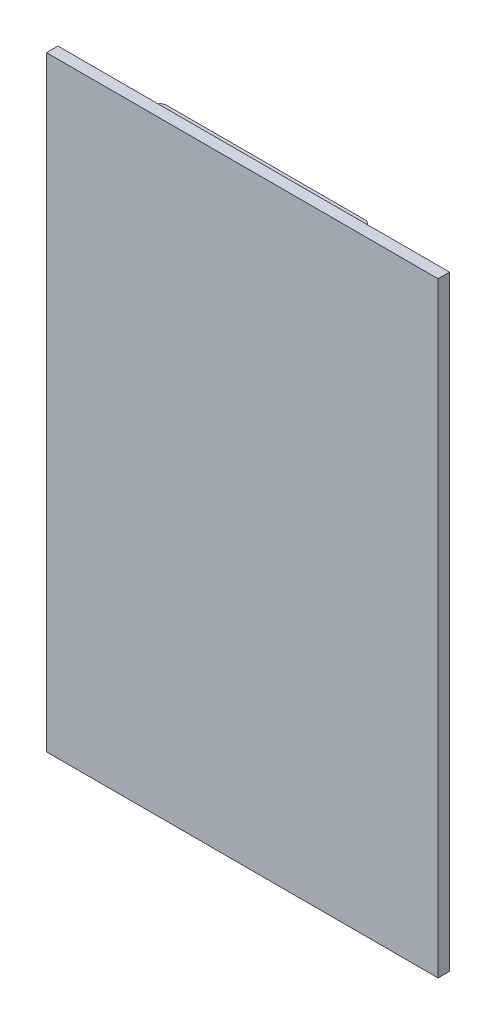
ISO-10303-21;
HEADER;
FILE_DESCRIPTION(('STEP AP214'),'2;1');
FILE_NAME('part.step','',(''),(''),'','','');
FILE_SCHEMA(('AUTOMOTIVE_DESIGN { 1 0 10303 214 1 1 1 1 }'));
ENDSEC;
DATA;
#1=APPLICATION_CONTEXT('core data for automotive mechanical design processes');
#2=APPLICATION_PROTOCOL_DEFINITION('international standard','automotive_design',2000,#1);
#3=PRODUCT_CONTEXT('',#1,'mechanical');
#4=PRODUCT('Part','Part','',(#3));
#5=PRODUCT_RELATED_PRODUCT_CATEGORY('part','',(#4));
#6=PRODUCT_DEFINITION_FORMATION('','',#4);
#7=PRODUCT_DEFINITION_CONTEXT('part definition',#1,'design');
#8=PRODUCT_DEFINITION('design','',#6,#7);
#9=PRODUCT_DEFINITION_SHAPE('','',#8);
#10=(LENGTH_UNIT() NAMED_UNIT(*) SI_UNIT(.MILLI.,.METRE.));
#11=(NAMED_UNIT(*) PLANE_ANGLE_UNIT() SI_UNIT($,.RADIAN.));
#12=(NAMED_UNIT(*) SI_UNIT($,.STERADIAN.) SOLID_ANGLE_UNIT());
#13=UNCERTAINTY_MEASURE_WITH_UNIT(LENGTH_MEASURE(1.E-05),#10,'distance_accuracy_value','');
#14=(GEOMETRIC_REPRESENTATION_CONTEXT(3) GLOBAL_UNCERTAINTY_ASSIGNED_CONTEXT((#13)) GLOBAL_UNIT_ASSIGNED_CONTEXT((#10,
#11,#12)) REPRESENTATION_CONTEXT('',''));
#15=CARTESIAN_POINT('',(0.,0.,0.));
#16=DIRECTION('',(0.,0.,1.));
#17=DIRECTION('',(1.,0.,0.));
#18=AXIS2_PLACEMENT_3D('',#15,#16,#17);
#19=CARTESIAN_POINT('',(0.,0.,0.));
#20=DIRECTION('',(0.,0.,1.));
#21=DIRECTION('',(1.,0.,0.));
#22=AXIS2_PLACEMENT_3D('',#19,#20,#21);
#23=PLANE('',#22);
#24=DIRECTION('',(0.,-1.,0.));
#25=VECTOR('',#24,1.);
#26=CARTESIAN_POINT('',(1.5,102.,0.));
#27=LINE('',#26,#25);
#28=CARTESIAN_POINT('',(1.5,102.,0.));
#29=VERTEX_POINT('',#28);
#30=CARTESIAN_POINT('',(1.50000000000001,1.5,0.));
#31=VERTEX_POINT('',#30);
#32=EDGE_CURVE('E276',#29,#31,#27,.T.);
#33=ORIENTED_EDGE('',*,*,#32,.F.);
#34=DIRECTION('',(-1.,0.,0.));
#35=VECTOR('',#34,1.);
#36=CARTESIAN_POINT('',(1.5,102.,0.));
#37=LINE('',#36,#35);
#38=CARTESIAN_POINT('',(66.5,102.,0.));
#39=VERTEX_POINT('',#38);
#40=EDGE_CURVE('E267',#39,#29,#37,.T.);
#41=ORIENTED_EDGE('',*,*,#40,.F.);
#42=DIRECTION('',(0.,1.,0.));
#43=VECTOR('',#42,1.);
#44=CARTESIAN_POINT('',(66.5,102.,0.));
#45=LINE('',#44,#43);
#46=CARTESIAN_POINT('',(66.5,1.5,0.));
#47=VERTEX_POINT('',#46);
#48=EDGE_CURVE('E271',#47,#39,#45,.T.);
#49=ORIENTED_EDGE('',*,*,#48,.F.);
#50=DIRECTION('',(1.,0.,0.));
#51=VECTOR('',#50,1.);
#52=CARTESIAN_POINT('',(1.50000000000001,1.5,0.));
#53=LINE('',#52,#51);
#54=EDGE_CURVE('E89',#31,#47,#53,.T.);
#55=ORIENTED_EDGE('',*,*,#54,.F.);
#56=EDGE_LOOP('',(#33,#41,#49,#55));
#57=FACE_BOUND('',#56,.T.);
#58=DIRECTION('',(0.,-1.,0.));
#59=VECTOR('',#58,1.);
#60=CARTESIAN_POINT('',(52.5,100.5,0.));
#61=LINE('',#60,#59);
#62=CARTESIAN_POINT('',(52.5,98.5,0.));
#63=VERTEX_POINT('',#62);
#64=CARTESIAN_POINT('',(52.5,100.5,0.));
#65=VERTEX_POINT('',#64);
#66=EDGE_CURVE('E141',#63,#65,#61,.F.);
#67=ORIENTED_EDGE('',*,*,#66,.T.);
#68=DIRECTION('',(1.,0.,0.));
#69=VECTOR('',#68,1.);
#70=CARTESIAN_POINT('',(51.5,100.5,0.));
#71=LINE('',#70,#69);
#72=CARTESIAN_POINT('',(15.5,100.5,0.));
#73=VERTEX_POINT('',#72);
#74=EDGE_CURVE('E150',#73,#65,#71,.T.);
#75=ORIENTED_EDGE('',*,*,#74,.F.);
#76=DIRECTION('',(0.,1.,0.));
#77=VECTOR('',#76,1.);
#78=CARTESIAN_POINT('',(15.5,97.5,0.));
#79=LINE('',#78,#77);
#80=CARTESIAN_POINT('',(15.5,98.5,0.));
#81=VERTEX_POINT('',#80);
#82=EDGE_CURVE('E180',#73,#81,#79,.F.);
#83=ORIENTED_EDGE('',*,*,#82,.T.);
#84=CARTESIAN_POINT('',(17.5,98.5,0.));
#85=DIRECTION('',(0.,0.,1.));
#86=DIRECTION('',(1.,0.,0.));
#87=AXIS2_PLACEMENT_3D('',#84,#85,#86);
#88=CIRCLE('',#87,2.);
#89=CARTESIAN_POINT('',(17.5,96.5,0.));
#90=VERTEX_POINT('',#89);
#91=EDGE_CURVE('E175',#90,#81,#88,.F.);
#92=ORIENTED_EDGE('',*,*,#91,.F.);
#93=DIRECTION('',(-1.,0.,0.));
#94=VECTOR('',#93,1.);
#95=CARTESIAN_POINT('',(51.5,96.5,0.));
#96=LINE('',#95,#94);
#97=CARTESIAN_POINT('',(50.5,96.5,0.));
#98=VERTEX_POINT('',#97);
#99=EDGE_CURVE('E204',#90,#98,#96,.F.);
#100=ORIENTED_EDGE('',*,*,#99,.T.);
#101=CARTESIAN_POINT('',(50.5,98.5,0.));
#102=DIRECTION('',(0.,0.,1.));
#103=DIRECTION('',(1.,0.,0.));
#104=AXIS2_PLACEMENT_3D('',#101,#102,#103);
#105=CIRCLE('',#104,2.);
#106=EDGE_CURVE('E200',#63,#98,#105,.F.);
#107=ORIENTED_EDGE('',*,*,#106,.F.);
#108=EDGE_LOOP('',(#67,#75,#83,#92,#100,#107));
#109=FACE_BOUND('',#108,.T.);
#110=ADVANCED_FACE('F39',(#57,#109),#23,.F.);
#111=CARTESIAN_POINT('',(1.5,102.,1.9));
#112=DIRECTION('',(1.,0.,0.));
#113=DIRECTION('',(0.,1.,0.));
#114=AXIS2_PLACEMENT_3D('',#111,#112,#113);
#115=PLANE('',#114);
#116=ORIENTED_EDGE('',*,*,#32,.T.);
#117=DIRECTION('',(0.,0.,-1.));
#118=VECTOR('',#117,1.);
#119=CARTESIAN_POINT('',(1.50000000000001,1.5,1.9));
#120=LINE('',#119,#118);
#121=CARTESIAN_POINT('',(1.50000000000001,1.5,1.9));
#122=VERTEX_POINT('',#121);
#123=EDGE_CURVE('E251',#122,#31,#120,.T.);
#124=ORIENTED_EDGE('',*,*,#123,.F.);
#125=DIRECTION('',(0.,-1.,0.));
#126=VECTOR('',#125,1.);
#127=CARTESIAN_POINT('',(1.5,102.,1.9));
#128=LINE('',#127,#126);
#129=CARTESIAN_POINT('',(1.5,102.,1.9));
#130=VERTEX_POINT('',#129);
#131=EDGE_CURVE('E270',#130,#122,#128,.T.);
#132=ORIENTED_EDGE('',*,*,#131,.F.);
#133=DIRECTION('',(0.,0.,-1.));
#134=VECTOR('',#133,1.);
#135=CARTESIAN_POINT('',(1.5,102.,1.9));
#136=LINE('',#135,#134);
#137=EDGE_CURVE('E262',#130,#29,#136,.T.);
#138=ORIENTED_EDGE('',*,*,#137,.T.);
#139=EDGE_LOOP('',(#116,#124,#132,#138));
#140=FACE_BOUND('',#139,.T.);
#141=ADVANCED_FACE('F306',(#140),#115,.F.);
#142=CARTESIAN_POINT('',(1.50000000000001,1.5,1.9));
#143=DIRECTION('',(0.,1.,0.));
#144=DIRECTION('',(0.,0.,1.));
#145=AXIS2_PLACEMENT_3D('',#142,#143,#144);
#146=PLANE('',#145);
#147=ORIENTED_EDGE('',*,*,#54,.T.);
#148=DIRECTION('',(0.,0.,-1.));
#149=VECTOR('',#148,1.);
#150=CARTESIAN_POINT('',(66.5,1.5,1.9));
#151=LINE('',#150,#149);
#152=CARTESIAN_POINT('',(66.5,1.5,1.9));
#153=VERTEX_POINT('',#152);
#154=EDGE_CURVE('E254',#153,#47,#151,.T.);
#155=ORIENTED_EDGE('',*,*,#154,.F.);
#156=DIRECTION('',(1.,0.,0.));
#157=VECTOR('',#156,1.);
#158=CARTESIAN_POINT('',(1.50000000000001,1.5,1.9));
#159=LINE('',#158,#157);
#160=EDGE_CURVE('E287',#122,#153,#159,.T.);
#161=ORIENTED_EDGE('',*,*,#160,.F.);
#162=ORIENTED_EDGE('',*,*,#123,.T.);
#163=EDGE_LOOP('',(#147,#155,#161,#162));
#164=FACE_BOUND('',#163,.T.);
#165=ADVANCED_FACE('F308',(#164),#146,.F.);
#166=CARTESIAN_POINT('',(66.5,102.,1.9));
#167=DIRECTION('',(-1.,0.,0.));
#168=DIRECTION('',(0.,-1.,0.));
#169=AXIS2_PLACEMENT_3D('',#166,#167,#168);
#170=PLANE('',#169);
#171=ORIENTED_EDGE('',*,*,#48,.T.);
#172=DIRECTION('',(0.,0.,-1.));
#173=VECTOR('',#172,1.);
#174=CARTESIAN_POINT('',(66.5,102.,1.9));
#175=LINE('',#174,#173);
#176=CARTESIAN_POINT('',(66.5,102.,1.9));
#177=VERTEX_POINT('',#176);
#178=EDGE_CURVE('E258',#177,#39,#175,.T.);
#179=ORIENTED_EDGE('',*,*,#178,.F.);
#180=DIRECTION('',(0.,1.,0.));
#181=VECTOR('',#180,1.);
#182=CARTESIAN_POINT('',(66.5,102.,1.9));
#183=LINE('',#182,#181);
#184=EDGE_CURVE('E283',#153,#177,#183,.T.);
#185=ORIENTED_EDGE('',*,*,#184,.F.);
#186=ORIENTED_EDGE('',*,*,#154,.T.);
#187=EDGE_LOOP('',(#171,#179,#185,#186));
#188=FACE_BOUND('',#187,.T.);
#189=ADVANCED_FACE('F314',(#188),#170,.F.);
#190=CARTESIAN_POINT('',(1.5,102.,1.9));
#191=DIRECTION('',(0.,-1.,0.));
#192=DIRECTION('',(0.,0.,-1.));
#193=AXIS2_PLACEMENT_3D('',#190,#191,#192);
#194=PLANE('',#193);
#195=ORIENTED_EDGE('',*,*,#40,.T.);
#196=ORIENTED_EDGE('',*,*,#137,.F.);
#197=DIRECTION('',(-1.,0.,0.));
#198=VECTOR('',#197,1.);
#199=CARTESIAN_POINT('',(1.5,102.,1.9));
#200=LINE('',#199,#198);
#201=EDGE_CURVE('E266',#177,#130,#200,.T.);
#202=ORIENTED_EDGE('',*,*,#201,.F.);
#203=ORIENTED_EDGE('',*,*,#178,.T.);
#204=EDGE_LOOP('',(#195,#196,#202,#203));
#205=FACE_BOUND('',#204,.T.);
#206=ADVANCED_FACE('F317',(#205),#194,.F.);
#207=CARTESIAN_POINT('',(0.,0.,1.9));
#208=DIRECTION('',(0.,0.,1.));
#209=DIRECTION('',(1.,0.,0.));
#210=AXIS2_PLACEMENT_3D('',#207,#208,#209);
#211=PLANE('',#210);
#212=ORIENTED_EDGE('',*,*,#131,.T.);
#213=ORIENTED_EDGE('',*,*,#160,.T.);
#214=ORIENTED_EDGE('',*,*,#184,.T.);
#215=ORIENTED_EDGE('',*,*,#201,.T.);
#216=EDGE_LOOP('',(#212,#213,#214,#215));
#217=FACE_BOUND('',#216,.T.);
#218=ADVANCED_FACE('F298',(#217),#211,.T.);
#219=CARTESIAN_POINT('',(51.5,100.5,-2.));
#220=DIRECTION('',(0.,-1.,0.));
#221=DIRECTION('',(0.,0.,-1.));
#222=AXIS2_PLACEMENT_3D('',#219,#220,#221);
#223=PLANE('',#222);
#224=DIRECTION('',(1.,0.,0.));
#225=VECTOR('',#224,1.);
#226=CARTESIAN_POINT('',(51.5,100.5,-2.));
#227=LINE('',#226,#225);
#228=CARTESIAN_POINT('',(17.5,100.5,-2.));
#229=VERTEX_POINT('',#228);
#230=CARTESIAN_POINT('',(50.5,100.5,-2.));
#231=VERTEX_POINT('',#230);
#232=EDGE_CURVE('E187',#229,#231,#227,.T.);
#233=ORIENTED_EDGE('',*,*,#232,.F.);
#234=CARTESIAN_POINT('',(17.5,100.5,-1.));
#235=DIRECTION('',(0.,-1.,0.));
#236=DIRECTION('',(0.,0.,-1.));
#237=AXIS2_PLACEMENT_3D('',#234,#235,#236);
#238=CIRCLE('',#237,1.);
#239=CARTESIAN_POINT('',(16.5,100.5,-1.));
#240=VERTEX_POINT('',#239);
#241=EDGE_CURVE('E58',#229,#240,#238,.F.);
#242=ORIENTED_EDGE('',*,*,#241,.T.);
#243=CARTESIAN_POINT('',(15.5,100.5,-1.));
#244=DIRECTION('',(0.,-1.,0.));
#245=DIRECTION('',(0.,0.,-1.));
#246=AXIS2_PLACEMENT_3D('',#243,#244,#245);
#247=CIRCLE('',#246,1.);
#248=EDGE_CURVE('E11',#240,#73,#247,.T.);
#249=ORIENTED_EDGE('',*,*,#248,.T.);
#250=ORIENTED_EDGE('',*,*,#74,.T.);
#251=CARTESIAN_POINT('',(52.5,100.5,-1.));
#252=DIRECTION('',(0.,-1.,0.));
#253=DIRECTION('',(0.,0.,-1.));
#254=AXIS2_PLACEMENT_3D('',#251,#252,#253);
#255=CIRCLE('',#254,1.);
#256=CARTESIAN_POINT('',(51.5,100.5,-1.));
#257=VERTEX_POINT('',#256);
#258=EDGE_CURVE('E50',#65,#257,#255,.T.);
#259=ORIENTED_EDGE('',*,*,#258,.T.);
#260=CARTESIAN_POINT('',(50.5,100.5,-1.));
#261=DIRECTION('',(0.,-1.,0.));
#262=DIRECTION('',(0.,0.,-1.));
#263=AXIS2_PLACEMENT_3D('',#260,#261,#262);
#264=CIRCLE('',#263,1.);
#265=EDGE_CURVE('E144',#257,#231,#264,.F.);
#266=ORIENTED_EDGE('',*,*,#265,.T.);
#267=EDGE_LOOP('',(#233,#242,#249,#250,#259,#266));
#268=FACE_BOUND('',#267,.T.);
#269=ADVANCED_FACE('F181',(#268),#223,.F.);
#270=CARTESIAN_POINT('',(0.,0.,-2.));
#271=DIRECTION('',(0.,0.,-1.));
#272=DIRECTION('',(-1.,0.,0.));
#273=AXIS2_PLACEMENT_3D('',#270,#271,#272);
#274=PLANE('',#273);
#275=DIRECTION('',(-1.,0.,0.));
#276=VECTOR('',#275,1.);
#277=CARTESIAN_POINT('',(16.5,98.5,-2.));
#278=LINE('',#277,#276);
#279=CARTESIAN_POINT('',(50.5,98.5,-2.));
#280=VERTEX_POINT('',#279);
#281=CARTESIAN_POINT('',(17.5,98.5,-2.));
#282=VERTEX_POINT('',#281);
#283=EDGE_CURVE('E132',#280,#282,#278,.T.);
#284=ORIENTED_EDGE('',*,*,#283,.T.);
#285=DIRECTION('',(0.,1.,0.));
#286=VECTOR('',#285,1.);
#287=CARTESIAN_POINT('',(17.5,100.5,-2.));
#288=LINE('',#287,#286);
#289=EDGE_CURVE('E135',#282,#229,#288,.T.);
#290=ORIENTED_EDGE('',*,*,#289,.T.);
#291=ORIENTED_EDGE('',*,*,#232,.T.);
#292=DIRECTION('',(0.,-1.,0.));
#293=VECTOR('',#292,1.);
#294=CARTESIAN_POINT('',(50.5,97.5,-2.));
#295=LINE('',#294,#293);
#296=EDGE_CURVE('E137',#231,#280,#295,.T.);
#297=ORIENTED_EDGE('',*,*,#296,.T.);
#298=EDGE_LOOP('',(#284,#290,#291,#297));
#299=FACE_BOUND('',#298,.T.);
#300=ADVANCED_FACE('F133',(#299),#274,.T.);
#301=CARTESIAN_POINT('',(17.5,0.,-1.));
#302=DIRECTION('',(0.,-1.,0.));
#303=DIRECTION('',(0.,0.,-1.));
#304=AXIS2_PLACEMENT_3D('',#301,#302,#303);
#305=CYLINDRICAL_SURFACE('',#304,1.);
#306=CARTESIAN_POINT('',(17.5,98.5,-1.));
#307=DIRECTION('',(0.,-1.,0.));
#308=DIRECTION('',(0.,0.,-1.));
#309=AXIS2_PLACEMENT_3D('',#306,#307,#308);
#310=CIRCLE('',#309,1.);
#311=CARTESIAN_POINT('',(16.5,98.5,-1.));
#312=VERTEX_POINT('',#311);
#313=EDGE_CURVE('E43',#312,#282,#310,.T.);
#314=ORIENTED_EDGE('',*,*,#313,.F.);
#315=DIRECTION('',(0.,1.,0.));
#316=VECTOR('',#315,1.);
#317=CARTESIAN_POINT('',(16.5,97.5,-1.));
#318=LINE('',#317,#316);
#319=EDGE_CURVE('E157',#240,#312,#318,.F.);
#320=ORIENTED_EDGE('',*,*,#319,.F.);
#321=ORIENTED_EDGE('',*,*,#241,.F.);
#322=ORIENTED_EDGE('',*,*,#289,.F.);
#323=EDGE_LOOP('',(#314,#320,#321,#322));
#324=FACE_BOUND('',#323,.T.);
#325=ADVANCED_FACE('F41',(#324),#305,.T.);
#326=CARTESIAN_POINT('',(17.5,98.5,-1.));
#327=DIRECTION('',(0.,0.,1.));
#328=DIRECTION('',(1.,0.,0.));
#329=AXIS2_PLACEMENT_3D('',#326,#327,#328);
#330=SPHERICAL_SURFACE('',#329,1.);
#331=CARTESIAN_POINT('',(17.5,98.5,-1.));
#332=DIRECTION('',(0.,0.,-1.));
#333=DIRECTION('',(-1.,0.,0.));
#334=AXIS2_PLACEMENT_3D('',#331,#332,#333);
#335=CIRCLE('',#334,1.);
#336=CARTESIAN_POINT('',(17.5,97.5,-1.));
#337=VERTEX_POINT('',#336);
#338=EDGE_CURVE('E147',#312,#337,#335,.F.);
#339=ORIENTED_EDGE('',*,*,#338,.F.);
#340=ORIENTED_EDGE('',*,*,#313,.T.);
#341=CARTESIAN_POINT('',(17.5,98.5,-1.));
#342=DIRECTION('',(-1.,0.,0.));
#343=DIRECTION('',(0.,0.,1.));
#344=AXIS2_PLACEMENT_3D('',#341,#342,#343);
#345=CIRCLE('',#344,1.);
#346=EDGE_CURVE('E76',#337,#282,#345,.F.);
#347=ORIENTED_EDGE('',*,*,#346,.F.);
#348=EDGE_LOOP('',(#339,#340,#347));
#349=FACE_BOUND('',#348,.T.);
#350=ADVANCED_FACE('F146',(#349),#330,.T.);
#351=CARTESIAN_POINT('',(15.5,100.5,-1.));
#352=DIRECTION('',(0.,-1.,0.));
#353=DIRECTION('',(0.,0.,-1.));
#354=AXIS2_PLACEMENT_3D('',#351,#352,#353);
#355=CYLINDRICAL_SURFACE('',#354,1.);
#356=ORIENTED_EDGE('',*,*,#248,.F.);
#357=ORIENTED_EDGE('',*,*,#319,.T.);
#358=CARTESIAN_POINT('',(15.5,98.5,-1.));
#359=DIRECTION('',(0.,1.,0.));
#360=DIRECTION('',(0.,0.,1.));
#361=AXIS2_PLACEMENT_3D('',#358,#359,#360);
#362=CIRCLE('',#361,1.);
#363=EDGE_CURVE('E158',#81,#312,#362,.T.);
#364=ORIENTED_EDGE('',*,*,#363,.F.);
#365=ORIENTED_EDGE('',*,*,#82,.F.);
#366=EDGE_LOOP('',(#356,#357,#364,#365));
#367=FACE_BOUND('',#366,.T.);
#368=ADVANCED_FACE('F179',(#367),#355,.F.);
#369=CARTESIAN_POINT('',(0.,98.5,-1.));
#370=DIRECTION('',(1.,0.,0.));
#371=DIRECTION('',(0.,0.,-1.));
#372=AXIS2_PLACEMENT_3D('',#369,#370,#371);
#373=CYLINDRICAL_SURFACE('',#372,1.);
#374=ORIENTED_EDGE('',*,*,#346,.T.);
#375=ORIENTED_EDGE('',*,*,#283,.F.);
#376=CARTESIAN_POINT('',(50.5,98.5,-1.));
#377=DIRECTION('',(1.,0.,0.));
#378=DIRECTION('',(0.,0.,-1.));
#379=AXIS2_PLACEMENT_3D('',#376,#377,#378);
#380=CIRCLE('',#379,1.);
#381=CARTESIAN_POINT('',(50.5,97.5,-1.));
#382=VERTEX_POINT('',#381);
#383=EDGE_CURVE('E164',#382,#280,#380,.T.);
#384=ORIENTED_EDGE('',*,*,#383,.F.);
#385=DIRECTION('',(-1.,0.,0.));
#386=VECTOR('',#385,1.);
#387=CARTESIAN_POINT('',(51.5,97.5,-1.));
#388=LINE('',#387,#386);
#389=EDGE_CURVE('E154',#337,#382,#388,.F.);
#390=ORIENTED_EDGE('',*,*,#389,.F.);
#391=EDGE_LOOP('',(#374,#375,#384,#390));
#392=FACE_BOUND('',#391,.T.);
#393=ADVANCED_FACE('F152',(#392),#373,.T.);
#394=CARTESIAN_POINT('',(17.5,98.5,-1.));
#395=DIRECTION('',(0.,0.,1.));
#396=DIRECTION('',(1.,0.,0.));
#397=AXIS2_PLACEMENT_3D('',#394,#395,#396);
#398=TOROIDAL_SURFACE('',#397,2.,1.);
#399=ORIENTED_EDGE('',*,*,#363,.T.);
#400=ORIENTED_EDGE('',*,*,#338,.T.);
#401=CARTESIAN_POINT('',(17.5,96.5,-1.));
#402=DIRECTION('',(1.,0.,0.));
#403=DIRECTION('',(0.,0.,-1.));
#404=AXIS2_PLACEMENT_3D('',#401,#402,#403);
#405=CIRCLE('',#404,1.);
#406=EDGE_CURVE('E172',#90,#337,#405,.F.);
#407=ORIENTED_EDGE('',*,*,#406,.F.);
#408=ORIENTED_EDGE('',*,*,#91,.T.);
#409=EDGE_LOOP('',(#399,#400,#407,#408));
#410=FACE_BOUND('',#409,.T.);
#411=ADVANCED_FACE('F170',(#410),#398,.F.);
#412=CARTESIAN_POINT('',(50.5,98.5,-1.));
#413=DIRECTION('',(0.,0.,1.));
#414=DIRECTION('',(1.,0.,0.));
#415=AXIS2_PLACEMENT_3D('',#412,#413,#414);
#416=SPHERICAL_SURFACE('',#415,1.);
#417=CARTESIAN_POINT('',(50.5,98.5,-1.));
#418=DIRECTION('',(0.,0.,-1.));
#419=DIRECTION('',(-1.,0.,0.));
#420=AXIS2_PLACEMENT_3D('',#417,#418,#419);
#421=CIRCLE('',#420,1.);
#422=CARTESIAN_POINT('',(51.5,98.5,-1.));
#423=VERTEX_POINT('',#422);
#424=EDGE_CURVE('E231',#382,#423,#421,.F.);
#425=ORIENTED_EDGE('',*,*,#424,.F.);
#426=ORIENTED_EDGE('',*,*,#383,.T.);
#427=CARTESIAN_POINT('',(50.5,98.5,-1.));
#428=DIRECTION('',(0.,-1.,0.));
#429=DIRECTION('',(0.,0.,-1.));
#430=AXIS2_PLACEMENT_3D('',#427,#428,#429);
#431=CIRCLE('',#430,1.);
#432=EDGE_CURVE('E223',#423,#280,#431,.F.);
#433=ORIENTED_EDGE('',*,*,#432,.F.);
#434=EDGE_LOOP('',(#425,#426,#433));
#435=FACE_BOUND('',#434,.T.);
#436=ADVANCED_FACE('F237',(#435),#416,.T.);
#437=CARTESIAN_POINT('',(51.5,96.5,-1.));
#438=DIRECTION('',(1.,0.,0.));
#439=DIRECTION('',(0.,0.,-1.));
#440=AXIS2_PLACEMENT_3D('',#437,#438,#439);
#441=CYLINDRICAL_SURFACE('',#440,1.);
#442=ORIENTED_EDGE('',*,*,#406,.T.);
#443=ORIENTED_EDGE('',*,*,#389,.T.);
#444=CARTESIAN_POINT('',(50.5,96.5,-1.));
#445=DIRECTION('',(-1.,0.,0.));
#446=DIRECTION('',(0.,0.,1.));
#447=AXIS2_PLACEMENT_3D('',#444,#445,#446);
#448=CIRCLE('',#447,1.);
#449=EDGE_CURVE('E219',#98,#382,#448,.T.);
#450=ORIENTED_EDGE('',*,*,#449,.F.);
#451=ORIENTED_EDGE('',*,*,#99,.F.);
#452=EDGE_LOOP('',(#442,#443,#450,#451));
#453=FACE_BOUND('',#452,.T.);
#454=ADVANCED_FACE('F244',(#453),#441,.F.);
#455=CARTESIAN_POINT('',(50.5,0.,-1.));
#456=DIRECTION('',(0.,1.,0.));
#457=DIRECTION('',(0.,0.,1.));
#458=AXIS2_PLACEMENT_3D('',#455,#456,#457);
#459=CYLINDRICAL_SURFACE('',#458,1.);
#460=ORIENTED_EDGE('',*,*,#296,.F.);
#461=ORIENTED_EDGE('',*,*,#265,.F.);
#462=DIRECTION('',(0.,-1.,0.));
#463=VECTOR('',#462,1.);
#464=CARTESIAN_POINT('',(51.5,100.5,-1.));
#465=LINE('',#464,#463);
#466=EDGE_CURVE('E196',#423,#257,#465,.F.);
#467=ORIENTED_EDGE('',*,*,#466,.F.);
#468=ORIENTED_EDGE('',*,*,#432,.T.);
#469=EDGE_LOOP('',(#460,#461,#467,#468));
#470=FACE_BOUND('',#469,.T.);
#471=ADVANCED_FACE('F239',(#470),#459,.T.);
#472=CARTESIAN_POINT('',(50.5,98.5,-1.));
#473=DIRECTION('',(0.,0.,1.));
#474=DIRECTION('',(1.,0.,0.));
#475=AXIS2_PLACEMENT_3D('',#472,#473,#474);
#476=TOROIDAL_SURFACE('',#475,2.,1.);
#477=ORIENTED_EDGE('',*,*,#449,.T.);
#478=ORIENTED_EDGE('',*,*,#424,.T.);
#479=CARTESIAN_POINT('',(52.5,98.5,-1.));
#480=DIRECTION('',(0.,1.,0.));
#481=DIRECTION('',(0.,0.,1.));
#482=AXIS2_PLACEMENT_3D('',#479,#480,#481);
#483=CIRCLE('',#482,1.);
#484=EDGE_CURVE('E214',#63,#423,#483,.F.);
#485=ORIENTED_EDGE('',*,*,#484,.F.);
#486=ORIENTED_EDGE('',*,*,#106,.T.);
#487=EDGE_LOOP('',(#477,#478,#485,#486));
#488=FACE_BOUND('',#487,.T.);
#489=ADVANCED_FACE('F241',(#488),#476,.F.);
#490=CARTESIAN_POINT('',(52.5,100.5,-1.));
#491=DIRECTION('',(0.,1.,0.));
#492=DIRECTION('',(0.,0.,1.));
#493=AXIS2_PLACEMENT_3D('',#490,#491,#492);
#494=CYLINDRICAL_SURFACE('',#493,1.);
#495=ORIENTED_EDGE('',*,*,#258,.F.);
#496=ORIENTED_EDGE('',*,*,#66,.F.);
#497=ORIENTED_EDGE('',*,*,#484,.T.);
#498=ORIENTED_EDGE('',*,*,#466,.T.);
#499=EDGE_LOOP('',(#495,#496,#497,#498));
#500=FACE_BOUND('',#499,.T.);
#501=ADVANCED_FACE('F192',(#500),#494,.F.);
#502=CLOSED_SHELL('',(#110,#141,#165,#189,#206,#218,#269,#300,#325,#350,#368,#393,#411,#436,
#454,#471,#489,#501));
#503=MANIFOLD_SOLID_BREP('B2',#502);
#504=ADVANCED_BREP_SHAPE_REPRESENTATION('',(#18,#503),#14);
#505=SHAPE_DEFINITION_REPRESENTATION(#9,#504);
ENDSEC;
END-ISO-10303-21;
